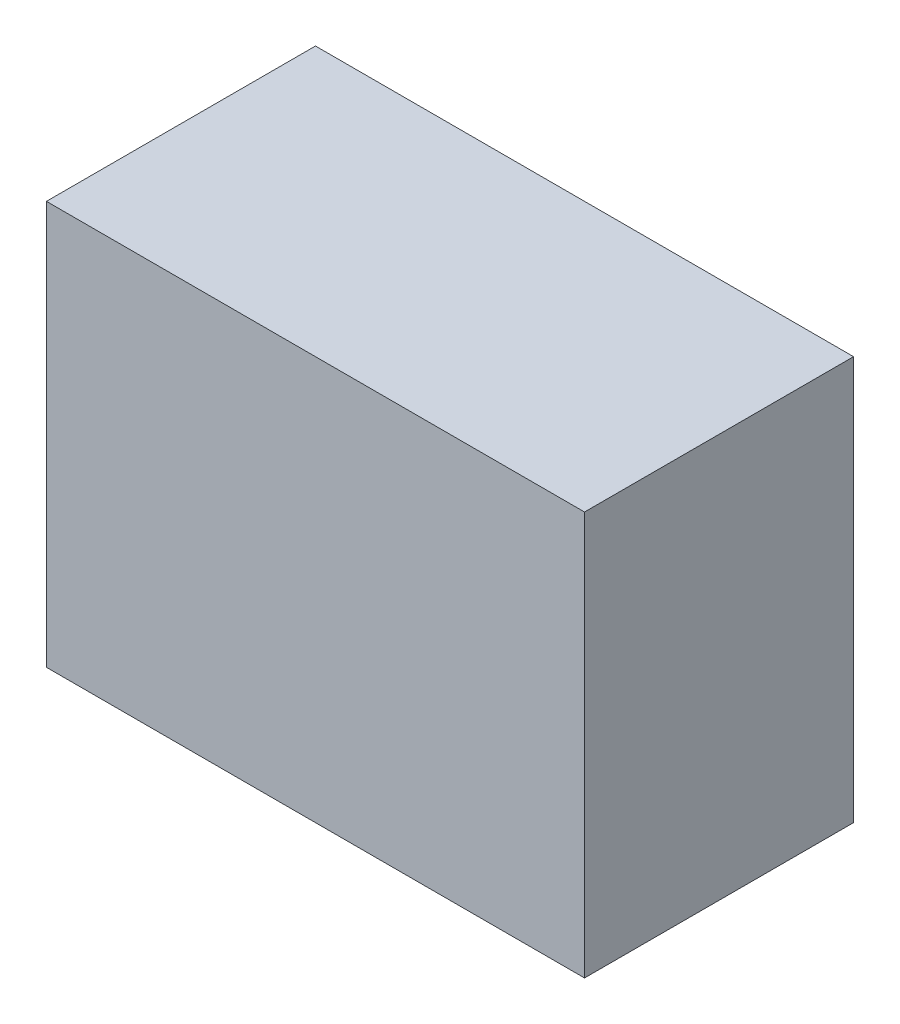
ISO-10303-21;
HEADER;
FILE_DESCRIPTION(('STEP AP214'),'2;1');
FILE_NAME('part.step','',(''),(''),'','','');
FILE_SCHEMA(('AUTOMOTIVE_DESIGN { 1 0 10303 214 1 1 1 1 }'));
ENDSEC;
DATA;
#1=APPLICATION_CONTEXT('core data for automotive mechanical design processes');
#2=APPLICATION_PROTOCOL_DEFINITION('international standard','automotive_design',2000,#1);
#3=PRODUCT_CONTEXT('',#1,'mechanical');
#4=PRODUCT('Part','Part','',(#3));
#5=PRODUCT_RELATED_PRODUCT_CATEGORY('part','',(#4));
#6=PRODUCT_DEFINITION_FORMATION('','',#4);
#7=PRODUCT_DEFINITION_CONTEXT('part definition',#1,'design');
#8=PRODUCT_DEFINITION('design','',#6,#7);
#9=PRODUCT_DEFINITION_SHAPE('','',#8);
#10=(LENGTH_UNIT() NAMED_UNIT(*) SI_UNIT(.MILLI.,.METRE.));
#11=(NAMED_UNIT(*) PLANE_ANGLE_UNIT() SI_UNIT($,.RADIAN.));
#12=(NAMED_UNIT(*) SI_UNIT($,.STERADIAN.) SOLID_ANGLE_UNIT());
#13=UNCERTAINTY_MEASURE_WITH_UNIT(LENGTH_MEASURE(1.E-05),#10,'distance_accuracy_value','');
#14=(GEOMETRIC_REPRESENTATION_CONTEXT(3) GLOBAL_UNCERTAINTY_ASSIGNED_CONTEXT((#13)) GLOBAL_UNIT_ASSIGNED_CONTEXT((#10,
#11,#12)) REPRESENTATION_CONTEXT('',''));
#15=CARTESIAN_POINT('',(0.,0.,0.));
#16=DIRECTION('',(0.,0.,1.));
#17=DIRECTION('',(1.,0.,0.));
#18=AXIS2_PLACEMENT_3D('',#15,#16,#17);
#19=CARTESIAN_POINT('',(-20.,15.,20.));
#20=DIRECTION('',(1.,0.,0.));
#21=DIRECTION('',(0.,0.,-1.));
#22=AXIS2_PLACEMENT_3D('',#19,#20,#21);
#23=PLANE('',#22);
#24=DIRECTION('',(0.,-1.,0.));
#25=VECTOR('',#24,1.);
#26=CARTESIAN_POINT('',(-20.,15.,0.));
#27=LINE('',#26,#25);
#28=CARTESIAN_POINT('',(-20.,15.,0.));
#29=VERTEX_POINT('',#28);
#30=CARTESIAN_POINT('',(-20.,-15.,0.));
#31=VERTEX_POINT('',#30);
#32=EDGE_CURVE('E104',#29,#31,#27,.T.);
#33=ORIENTED_EDGE('',*,*,#32,.T.);
#34=DIRECTION('',(0.,0.,-1.));
#35=VECTOR('',#34,1.);
#36=CARTESIAN_POINT('',(-20.,-15.,20.));
#37=LINE('',#36,#35);
#38=CARTESIAN_POINT('',(-20.,-15.,20.));
#39=VERTEX_POINT('',#38);
#40=EDGE_CURVE('E11',#39,#31,#37,.T.);
#41=ORIENTED_EDGE('',*,*,#40,.F.);
#42=DIRECTION('',(0.,-1.,0.));
#43=VECTOR('',#42,1.);
#44=CARTESIAN_POINT('',(-20.,15.,20.));
#45=LINE('',#44,#43);
#46=CARTESIAN_POINT('',(-20.,15.,20.));
#47=VERTEX_POINT('',#46);
#48=EDGE_CURVE('E92',#47,#39,#45,.T.);
#49=ORIENTED_EDGE('',*,*,#48,.F.);
#50=DIRECTION('',(0.,0.,-1.));
#51=VECTOR('',#50,1.);
#52=CARTESIAN_POINT('',(-20.,15.,20.));
#53=LINE('',#52,#51);
#54=EDGE_CURVE('E100',#47,#29,#53,.T.);
#55=ORIENTED_EDGE('',*,*,#54,.T.);
#56=EDGE_LOOP('',(#33,#41,#49,#55));
#57=FACE_BOUND('',#56,.T.);
#58=ADVANCED_FACE('F41',(#57),#23,.F.);
#59=CARTESIAN_POINT('',(-20.,-15.,20.));
#60=DIRECTION('',(0.,1.,0.));
#61=DIRECTION('',(0.,0.,1.));
#62=AXIS2_PLACEMENT_3D('',#59,#60,#61);
#63=PLANE('',#62);
#64=DIRECTION('',(1.,0.,0.));
#65=VECTOR('',#64,1.);
#66=CARTESIAN_POINT('',(-20.,-15.,0.));
#67=LINE('',#66,#65);
#68=CARTESIAN_POINT('',(20.,-15.,0.));
#69=VERTEX_POINT('',#68);
#70=EDGE_CURVE('E96',#31,#69,#67,.T.);
#71=ORIENTED_EDGE('',*,*,#70,.T.);
#72=DIRECTION('',(0.,0.,-1.));
#73=VECTOR('',#72,1.);
#74=CARTESIAN_POINT('',(20.,-15.,20.));
#75=LINE('',#74,#73);
#76=CARTESIAN_POINT('',(20.,-15.,20.));
#77=VERTEX_POINT('',#76);
#78=EDGE_CURVE('E49',#77,#69,#75,.T.);
#79=ORIENTED_EDGE('',*,*,#78,.F.);
#80=DIRECTION('',(1.,0.,0.));
#81=VECTOR('',#80,1.);
#82=CARTESIAN_POINT('',(-20.,-15.,20.));
#83=LINE('',#82,#81);
#84=EDGE_CURVE('E87',#39,#77,#83,.T.);
#85=ORIENTED_EDGE('',*,*,#84,.F.);
#86=ORIENTED_EDGE('',*,*,#40,.T.);
#87=EDGE_LOOP('',(#71,#79,#85,#86));
#88=FACE_BOUND('',#87,.T.);
#89=ADVANCED_FACE('F95',(#88),#63,.F.);
#90=CARTESIAN_POINT('',(20.,-15.,20.));
#91=DIRECTION('',(-1.,0.,0.));
#92=DIRECTION('',(0.,0.,1.));
#93=AXIS2_PLACEMENT_3D('',#90,#91,#92);
#94=PLANE('',#93);
#95=DIRECTION('',(0.,1.,0.));
#96=VECTOR('',#95,1.);
#97=CARTESIAN_POINT('',(20.,-15.,0.));
#98=LINE('',#97,#96);
#99=CARTESIAN_POINT('',(20.,15.,0.));
#100=VERTEX_POINT('',#99);
#101=EDGE_CURVE('E74',#69,#100,#98,.T.);
#102=ORIENTED_EDGE('',*,*,#101,.T.);
#103=DIRECTION('',(0.,0.,-1.));
#104=VECTOR('',#103,1.);
#105=CARTESIAN_POINT('',(20.,15.,20.));
#106=LINE('',#105,#104);
#107=CARTESIAN_POINT('',(20.,15.,20.));
#108=VERTEX_POINT('',#107);
#109=EDGE_CURVE('E97',#108,#100,#106,.T.);
#110=ORIENTED_EDGE('',*,*,#109,.F.);
#111=DIRECTION('',(0.,1.,0.));
#112=VECTOR('',#111,1.);
#113=CARTESIAN_POINT('',(20.,-15.,20.));
#114=LINE('',#113,#112);
#115=EDGE_CURVE('E90',#77,#108,#114,.T.);
#116=ORIENTED_EDGE('',*,*,#115,.F.);
#117=ORIENTED_EDGE('',*,*,#78,.T.);
#118=EDGE_LOOP('',(#102,#110,#116,#117));
#119=FACE_BOUND('',#118,.T.);
#120=ADVANCED_FACE('F98',(#119),#94,.F.);
#121=CARTESIAN_POINT('',(20.,15.,20.));
#122=DIRECTION('',(0.,-1.,0.));
#123=DIRECTION('',(0.,0.,-1.));
#124=AXIS2_PLACEMENT_3D('',#121,#122,#123);
#125=PLANE('',#124);
#126=DIRECTION('',(-1.,0.,0.));
#127=VECTOR('',#126,1.);
#128=CARTESIAN_POINT('',(20.,15.,0.));
#129=LINE('',#128,#127);
#130=EDGE_CURVE('E80',#100,#29,#129,.T.);
#131=ORIENTED_EDGE('',*,*,#130,.T.);
#132=ORIENTED_EDGE('',*,*,#54,.F.);
#133=DIRECTION('',(-1.,0.,0.));
#134=VECTOR('',#133,1.);
#135=CARTESIAN_POINT('',(20.,15.,20.));
#136=LINE('',#135,#134);
#137=EDGE_CURVE('E57',#108,#47,#136,.T.);
#138=ORIENTED_EDGE('',*,*,#137,.F.);
#139=ORIENTED_EDGE('',*,*,#109,.T.);
#140=EDGE_LOOP('',(#131,#132,#138,#139));
#141=FACE_BOUND('',#140,.T.);
#142=ADVANCED_FACE('F111',(#141),#125,.F.);
#143=CARTESIAN_POINT('',(0.,0.,20.));
#144=DIRECTION('',(0.,0.,1.));
#145=DIRECTION('',(1.,0.,0.));
#146=AXIS2_PLACEMENT_3D('',#143,#144,#145);
#147=PLANE('',#146);
#148=ORIENTED_EDGE('',*,*,#48,.T.);
#149=ORIENTED_EDGE('',*,*,#84,.T.);
#150=ORIENTED_EDGE('',*,*,#115,.T.);
#151=ORIENTED_EDGE('',*,*,#137,.T.);
#152=EDGE_LOOP('',(#148,#149,#150,#151));
#153=FACE_BOUND('',#152,.T.);
#154=ADVANCED_FACE('F88',(#153),#147,.T.);
#155=CARTESIAN_POINT('',(0.,0.,0.));
#156=DIRECTION('',(0.,0.,1.));
#157=DIRECTION('',(1.,0.,0.));
#158=AXIS2_PLACEMENT_3D('',#155,#156,#157);
#159=PLANE('',#158);
#160=ORIENTED_EDGE('',*,*,#32,.F.);
#161=ORIENTED_EDGE('',*,*,#130,.F.);
#162=ORIENTED_EDGE('',*,*,#101,.F.);
#163=ORIENTED_EDGE('',*,*,#70,.F.);
#164=EDGE_LOOP('',(#160,#161,#162,#163));
#165=FACE_BOUND('',#164,.T.);
#166=ADVANCED_FACE('F114',(#165),#159,.F.);
#167=CLOSED_SHELL('',(#58,#89,#120,#142,#154,#166));
#168=MANIFOLD_SOLID_BREP('B2',#167);
#169=ADVANCED_BREP_SHAPE_REPRESENTATION('',(#18,#168),#14);
#170=SHAPE_DEFINITION_REPRESENTATION(#9,#169);
ENDSEC;
END-ISO-10303-21;
